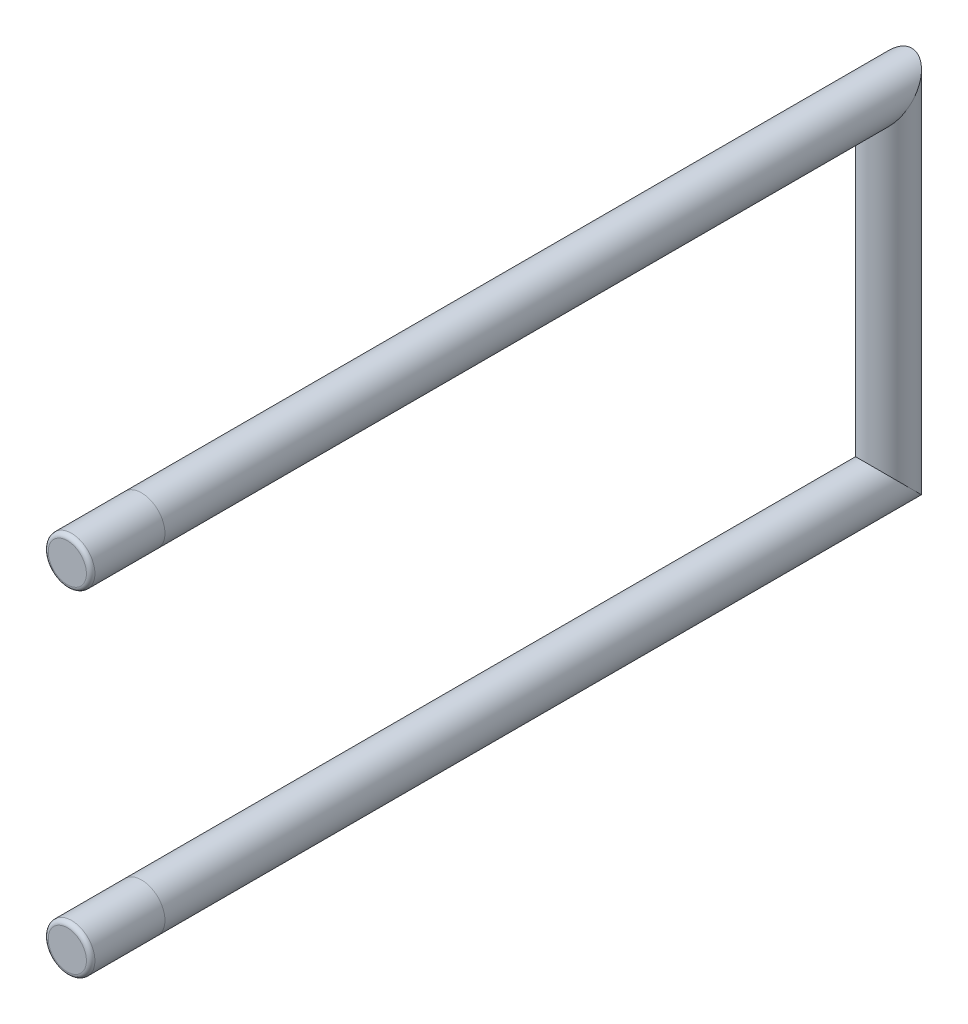
ISO-10303-21;
HEADER;
FILE_DESCRIPTION(('STEP AP214'),'2;1');
FILE_NAME('part.step','',(''),(''),'','','');
FILE_SCHEMA(('AUTOMOTIVE_DESIGN { 1 0 10303 214 1 1 1 1 }'));
ENDSEC;
DATA;
#1=APPLICATION_CONTEXT('core data for automotive mechanical design processes');
#2=APPLICATION_PROTOCOL_DEFINITION('international standard','automotive_design',2000,#1);
#3=PRODUCT_CONTEXT('',#1,'mechanical');
#4=PRODUCT('Part','Part','',(#3));
#5=PRODUCT_RELATED_PRODUCT_CATEGORY('part','',(#4));
#6=PRODUCT_DEFINITION_FORMATION('','',#4);
#7=PRODUCT_DEFINITION_CONTEXT('part definition',#1,'design');
#8=PRODUCT_DEFINITION('design','',#6,#7);
#9=PRODUCT_DEFINITION_SHAPE('','',#8);
#10=(LENGTH_UNIT() NAMED_UNIT(*) SI_UNIT(.MILLI.,.METRE.));
#11=(NAMED_UNIT(*) PLANE_ANGLE_UNIT() SI_UNIT($,.RADIAN.));
#12=(NAMED_UNIT(*) SI_UNIT($,.STERADIAN.) SOLID_ANGLE_UNIT());
#13=UNCERTAINTY_MEASURE_WITH_UNIT(LENGTH_MEASURE(1.E-05),#10,'distance_accuracy_value','');
#14=(GEOMETRIC_REPRESENTATION_CONTEXT(3) GLOBAL_UNCERTAINTY_ASSIGNED_CONTEXT((#13)) GLOBAL_UNIT_ASSIGNED_CONTEXT((#10,
#11,#12)) REPRESENTATION_CONTEXT('',''));
#15=CARTESIAN_POINT('',(0.,0.,0.));
#16=DIRECTION('',(0.,0.,1.));
#17=DIRECTION('',(1.,0.,0.));
#18=AXIS2_PLACEMENT_3D('',#15,#16,#17);
#19=CARTESIAN_POINT('',(0.,158.,0.));
#20=DIRECTION('',(0.,-1.,0.));
#21=DIRECTION('',(0.,0.,-1.));
#22=AXIS2_PLACEMENT_3D('',#19,#20,#21);
#23=CYLINDRICAL_SURFACE('',#22,11.);
#24=CARTESIAN_POINT('',(0.,0.,0.));
#25=DIRECTION('',(0.,0.707106781186547,-0.707106781186547));
#26=DIRECTION('',(0.,-0.707106781186547,-0.707106781186547));
#27=AXIS2_PLACEMENT_3D('',#24,#25,#26);
#28=ELLIPSE('',#27,15.556349186104,11.);
#29=CARTESIAN_POINT('',(-0.104879692967884,-10.9995000000001,-10.9995000000001));
#30=VERTEX_POINT('',#29);
#31=CARTESIAN_POINT('',(0.104879692967884,-10.9995000000001,-10.9995000000001));
#32=VERTEX_POINT('',#31);
#33=EDGE_CURVE('E48',#30,#32,#28,.T.);
#34=ORIENTED_EDGE('',*,*,#33,.T.);
#35=CARTESIAN_POINT('',(0.,-21.9990000000002,0.));
#36=DIRECTION('',(0.,-0.707106781186551,-0.707106781186544));
#37=DIRECTION('',(0.,-0.707106781186544,0.707106781186551));
#38=AXIS2_PLACEMENT_3D('',#35,#36,#37);
#39=ELLIPSE('',#38,15.556349186104,11.);
#40=EDGE_CURVE('E72',#32,#30,#39,.F.);
#41=ORIENTED_EDGE('',*,*,#40,.T.);
#42=EDGE_LOOP('',(#34,#41));
#43=FACE_BOUND('',#42,.T.);
#44=CARTESIAN_POINT('',(0.,158.,0.));
#45=DIRECTION('',(0.,-0.707106781186547,-0.707106781186547));
#46=DIRECTION('',(0.,-0.707106781186547,0.707106781186547));
#47=AXIS2_PLACEMENT_3D('',#44,#45,#46);
#48=ELLIPSE('',#47,15.556349186104,11.);
#49=CARTESIAN_POINT('',(-0.104879692967824,168.9995,-10.9995000000001));
#50=VERTEX_POINT('',#49);
#51=CARTESIAN_POINT('',(0.104879692967745,168.9995,-10.9995000000001));
#52=VERTEX_POINT('',#51);
#53=EDGE_CURVE('E60',#50,#52,#48,.F.);
#54=ORIENTED_EDGE('',*,*,#53,.F.);
#55=CARTESIAN_POINT('',(0.,179.999,0.));
#56=DIRECTION('',(0.,-0.707106781186551,0.707106781186544));
#57=DIRECTION('',(0.,-0.707106781186544,-0.707106781186551));
#58=AXIS2_PLACEMENT_3D('',#55,#56,#57);
#59=ELLIPSE('',#58,15.556349186104,11.);
#60=EDGE_CURVE('E71',#50,#52,#59,.T.);
#61=ORIENTED_EDGE('',*,*,#60,.T.);
#62=EDGE_LOOP('',(#54,#61));
#63=FACE_BOUND('',#62,.T.);
#64=ADVANCED_FACE('F34',(#43,#63),#23,.T.);
#65=CARTESIAN_POINT('',(0.,0.,352.));
#66=DIRECTION('',(0.,0.,-1.));
#67=DIRECTION('',(-1.,0.,0.));
#68=AXIS2_PLACEMENT_3D('',#65,#66,#67);
#69=CYLINDRICAL_SURFACE('',#68,11.);
#70=CARTESIAN_POINT('',(0.,0.,352.));
#71=DIRECTION('',(0.,0.,1.));
#72=DIRECTION('',(1.,0.,0.));
#73=AXIS2_PLACEMENT_3D('',#70,#71,#72);
#74=CIRCLE('',#73,10.9995);
#75=CARTESIAN_POINT('',(10.9995,0.,352.));
#76=VERTEX_POINT('',#75);
#77=EDGE_CURVE('E74',#76,#76,#74,.T.);
#78=ORIENTED_EDGE('',*,*,#77,.F.);
#79=EDGE_LOOP('',(#78));
#80=FACE_BOUND('',#79,.T.);
#81=ORIENTED_EDGE('',*,*,#33,.F.);
#82=CARTESIAN_POINT('',(0.,0.,-21.9990000000004));
#83=DIRECTION('',(0.,-0.707106781186551,-0.707106781186544));
#84=DIRECTION('',(0.,0.707106781186544,-0.707106781186551));
#85=AXIS2_PLACEMENT_3D('',#82,#83,#84);
#86=ELLIPSE('',#85,15.5563491861041,11.);
#87=EDGE_CURVE('E84',#30,#32,#86,.F.);
#88=ORIENTED_EDGE('',*,*,#87,.T.);
#89=EDGE_LOOP('',(#81,#88));
#90=FACE_BOUND('',#89,.T.);
#91=ADVANCED_FACE('F106',(#80,#90),#69,.T.);
#92=CARTESIAN_POINT('',(0.,158.,352.));
#93=DIRECTION('',(0.,0.,-1.));
#94=DIRECTION('',(-1.,0.,0.));
#95=AXIS2_PLACEMENT_3D('',#92,#93,#94);
#96=CYLINDRICAL_SURFACE('',#95,11.);
#97=CARTESIAN_POINT('',(0.,158.,352.));
#98=DIRECTION('',(0.,0.,1.));
#99=DIRECTION('',(1.,0.,0.));
#100=AXIS2_PLACEMENT_3D('',#97,#98,#99);
#101=CIRCLE('',#100,10.9995);
#102=CARTESIAN_POINT('',(10.9995,158.,352.));
#103=VERTEX_POINT('',#102);
#104=EDGE_CURVE('E67',#103,#103,#101,.T.);
#105=ORIENTED_EDGE('',*,*,#104,.F.);
#106=EDGE_LOOP('',(#105));
#107=FACE_BOUND('',#106,.T.);
#108=ORIENTED_EDGE('',*,*,#53,.T.);
#109=CARTESIAN_POINT('',(0.,158.,-21.9990000000004));
#110=DIRECTION('',(0.,-0.707106781186551,0.707106781186544));
#111=DIRECTION('',(0.,-0.707106781186544,-0.707106781186551));
#112=AXIS2_PLACEMENT_3D('',#109,#110,#111);
#113=ELLIPSE('',#112,15.5563491861041,11.);
#114=EDGE_CURVE('E63',#52,#50,#113,.T.);
#115=ORIENTED_EDGE('',*,*,#114,.T.);
#116=EDGE_LOOP('',(#108,#115));
#117=FACE_BOUND('',#116,.T.);
#118=ADVANCED_FACE('F62',(#107,#117),#96,.T.);
#119=CARTESIAN_POINT('',(0.,158.,387.));
#120=DIRECTION('',(0.,0.,-1.));
#121=DIRECTION('',(-1.,0.,0.));
#122=AXIS2_PLACEMENT_3D('',#119,#120,#121);
#123=CYLINDRICAL_SURFACE('',#122,10.9995);
#124=CARTESIAN_POINT('',(0.,158.,385.));
#125=DIRECTION('',(0.,0.,1.));
#126=DIRECTION('',(1.,0.,0.));
#127=AXIS2_PLACEMENT_3D('',#124,#125,#126);
#128=CIRCLE('',#127,10.9995);
#129=CARTESIAN_POINT('',(10.9995,158.,385.));
#130=VERTEX_POINT('',#129);
#131=EDGE_CURVE('E11',#130,#130,#128,.F.);
#132=ORIENTED_EDGE('',*,*,#131,.T.);
#133=EDGE_LOOP('',(#132));
#134=FACE_BOUND('',#133,.T.);
#135=ORIENTED_EDGE('',*,*,#104,.T.);
#136=EDGE_LOOP('',(#135));
#137=FACE_BOUND('',#136,.T.);
#138=ADVANCED_FACE('F166',(#134,#137),#123,.T.);
#139=CARTESIAN_POINT('',(0.,158.,387.));
#140=DIRECTION('',(0.,0.,1.));
#141=DIRECTION('',(1.,0.,0.));
#142=AXIS2_PLACEMENT_3D('',#139,#140,#141);
#143=PLANE('',#142);
#144=CARTESIAN_POINT('',(0.,158.,387.));
#145=DIRECTION('',(0.,0.,1.));
#146=DIRECTION('',(1.,0.,0.));
#147=AXIS2_PLACEMENT_3D('',#144,#145,#146);
#148=CIRCLE('',#147,8.9995);
#149=CARTESIAN_POINT('',(8.9995,158.,387.));
#150=VERTEX_POINT('',#149);
#151=EDGE_CURVE('E42',#150,#150,#148,.T.);
#152=ORIENTED_EDGE('',*,*,#151,.T.);
#153=EDGE_LOOP('',(#152));
#154=FACE_BOUND('',#153,.T.);
#155=ADVANCED_FACE('F94',(#154),#143,.T.);
#156=CARTESIAN_POINT('',(0.,0.,387.));
#157=DIRECTION('',(0.,0.,-1.));
#158=DIRECTION('',(-1.,0.,0.));
#159=AXIS2_PLACEMENT_3D('',#156,#157,#158);
#160=CYLINDRICAL_SURFACE('',#159,10.9995);
#161=CARTESIAN_POINT('',(0.,0.,385.));
#162=DIRECTION('',(0.,0.,1.));
#163=DIRECTION('',(1.,0.,0.));
#164=AXIS2_PLACEMENT_3D('',#161,#162,#163);
#165=CIRCLE('',#164,10.9995);
#166=CARTESIAN_POINT('',(10.9995,0.,385.));
#167=VERTEX_POINT('',#166);
#168=EDGE_CURVE('E89',#167,#167,#165,.F.);
#169=ORIENTED_EDGE('',*,*,#168,.T.);
#170=EDGE_LOOP('',(#169));
#171=FACE_BOUND('',#170,.T.);
#172=ORIENTED_EDGE('',*,*,#77,.T.);
#173=EDGE_LOOP('',(#172));
#174=FACE_BOUND('',#173,.T.);
#175=ADVANCED_FACE('F145',(#171,#174),#160,.T.);
#176=CARTESIAN_POINT('',(0.,0.,387.));
#177=DIRECTION('',(0.,0.,1.));
#178=DIRECTION('',(1.,0.,0.));
#179=AXIS2_PLACEMENT_3D('',#176,#177,#178);
#180=PLANE('',#179);
#181=CARTESIAN_POINT('',(0.,0.,387.));
#182=DIRECTION('',(0.,0.,1.));
#183=DIRECTION('',(1.,0.,0.));
#184=AXIS2_PLACEMENT_3D('',#181,#182,#183);
#185=CIRCLE('',#184,8.9995);
#186=CARTESIAN_POINT('',(8.9995,0.,387.));
#187=VERTEX_POINT('',#186);
#188=EDGE_CURVE('E86',#187,#187,#185,.T.);
#189=ORIENTED_EDGE('',*,*,#188,.T.);
#190=EDGE_LOOP('',(#189));
#191=FACE_BOUND('',#190,.T.);
#192=ADVANCED_FACE('F119',(#191),#180,.T.);
#193=CARTESIAN_POINT('',(0.,158.,-21.9990000000004));
#194=DIRECTION('',(0.,-0.707106781186551,0.707106781186544));
#195=DIRECTION('',(0.,-0.707106781186544,-0.707106781186551));
#196=AXIS2_PLACEMENT_3D('',#193,#194,#195);
#197=PLANE('',#196);
#198=ORIENTED_EDGE('',*,*,#60,.F.);
#199=ORIENTED_EDGE('',*,*,#114,.F.);
#200=EDGE_LOOP('',(#198,#199));
#201=FACE_BOUND('',#200,.T.);
#202=ADVANCED_FACE('F70',(#201),#197,.F.);
#203=CARTESIAN_POINT('',(0.,0.,-21.9990000000004));
#204=DIRECTION('',(0.,-0.707106781186551,-0.707106781186544));
#205=DIRECTION('',(0.,0.707106781186544,-0.707106781186551));
#206=AXIS2_PLACEMENT_3D('',#203,#204,#205);
#207=PLANE('',#206);
#208=ORIENTED_EDGE('',*,*,#40,.F.);
#209=ORIENTED_EDGE('',*,*,#87,.F.);
#210=EDGE_LOOP('',(#208,#209));
#211=FACE_BOUND('',#210,.T.);
#212=ADVANCED_FACE('F102',(#211),#207,.T.);
#213=CARTESIAN_POINT('',(0.,0.,385.));
#214=DIRECTION('',(0.,0.,1.));
#215=DIRECTION('',(1.,0.,0.));
#216=AXIS2_PLACEMENT_3D('',#213,#214,#215);
#217=TOROIDAL_SURFACE('',#216,8.9995,2.);
#218=ORIENTED_EDGE('',*,*,#168,.F.);
#219=EDGE_LOOP('',(#218));
#220=FACE_BOUND('',#219,.T.);
#221=ORIENTED_EDGE('',*,*,#188,.F.);
#222=EDGE_LOOP('',(#221));
#223=FACE_BOUND('',#222,.T.);
#224=ADVANCED_FACE('F97',(#220,#223),#217,.T.);
#225=CARTESIAN_POINT('',(0.,158.,385.));
#226=DIRECTION('',(0.,0.,1.));
#227=DIRECTION('',(1.,0.,0.));
#228=AXIS2_PLACEMENT_3D('',#225,#226,#227);
#229=TOROIDAL_SURFACE('',#228,8.9995,2.);
#230=ORIENTED_EDGE('',*,*,#131,.F.);
#231=EDGE_LOOP('',(#230));
#232=FACE_BOUND('',#231,.T.);
#233=ORIENTED_EDGE('',*,*,#151,.F.);
#234=EDGE_LOOP('',(#233));
#235=FACE_BOUND('',#234,.T.);
#236=ADVANCED_FACE('F36',(#232,#235),#229,.T.);
#237=CLOSED_SHELL('',(#64,#91,#118,#138,#155,#175,#192,#202,#212,#224,#236));
#238=MANIFOLD_SOLID_BREP('B2',#237);
#239=ADVANCED_BREP_SHAPE_REPRESENTATION('',(#18,#238),#14);
#240=SHAPE_DEFINITION_REPRESENTATION(#9,#239);
ENDSEC;
END-ISO-10303-21;
